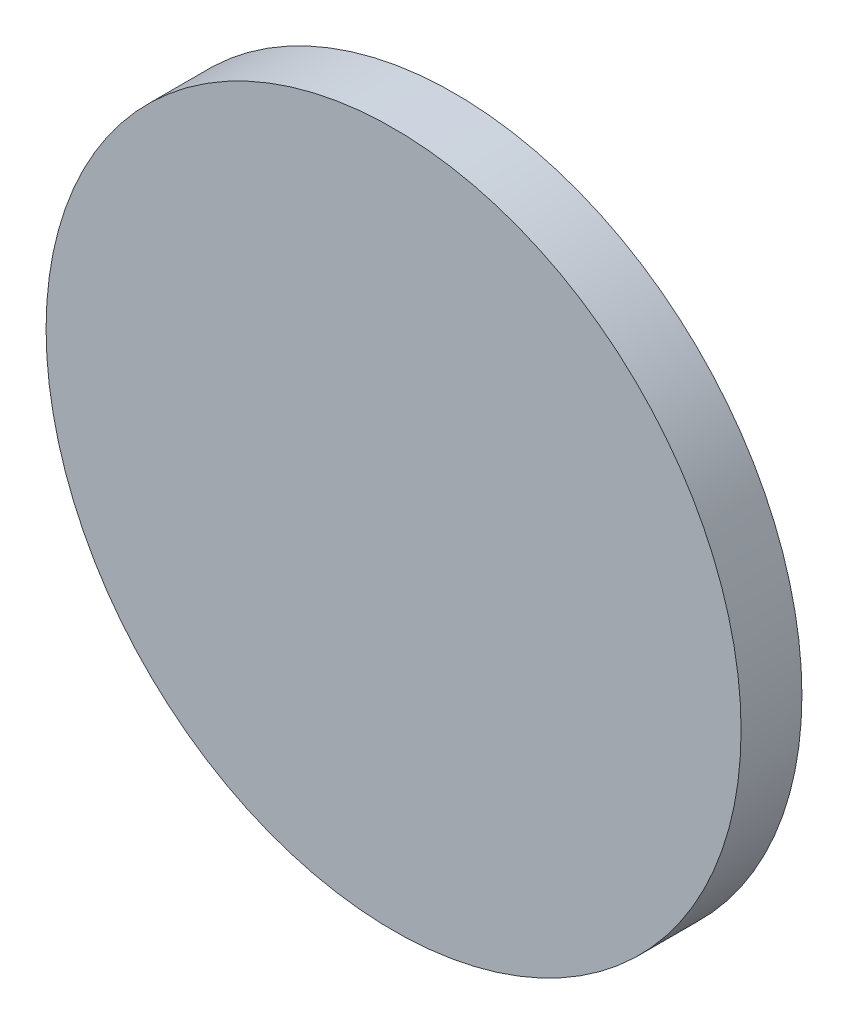
ISO-10303-21;
HEADER;
FILE_DESCRIPTION(('STEP AP214'),'2;1');
FILE_NAME('part.step','',(''),(''),'','','');
FILE_SCHEMA(('AUTOMOTIVE_DESIGN { 1 0 10303 214 1 1 1 1 }'));
ENDSEC;
DATA;
#1=APPLICATION_CONTEXT('core data for automotive mechanical design processes');
#2=APPLICATION_PROTOCOL_DEFINITION('international standard','automotive_design',2000,#1);
#3=PRODUCT_CONTEXT('',#1,'mechanical');
#4=PRODUCT('Part','Part','',(#3));
#5=PRODUCT_RELATED_PRODUCT_CATEGORY('part','',(#4));
#6=PRODUCT_DEFINITION_FORMATION('','',#4);
#7=PRODUCT_DEFINITION_CONTEXT('part definition',#1,'design');
#8=PRODUCT_DEFINITION('design','',#6,#7);
#9=PRODUCT_DEFINITION_SHAPE('','',#8);
#10=(LENGTH_UNIT() NAMED_UNIT(*) SI_UNIT(.MILLI.,.METRE.));
#11=(NAMED_UNIT(*) PLANE_ANGLE_UNIT() SI_UNIT($,.RADIAN.));
#12=(NAMED_UNIT(*) SI_UNIT($,.STERADIAN.) SOLID_ANGLE_UNIT());
#13=UNCERTAINTY_MEASURE_WITH_UNIT(LENGTH_MEASURE(1.E-05),#10,'distance_accuracy_value','');
#14=(GEOMETRIC_REPRESENTATION_CONTEXT(3) GLOBAL_UNCERTAINTY_ASSIGNED_CONTEXT((#13)) GLOBAL_UNIT_ASSIGNED_CONTEXT((#10,
#11,#12)) REPRESENTATION_CONTEXT('',''));
#15=CARTESIAN_POINT('',(0.,0.,0.));
#16=DIRECTION('',(0.,0.,1.));
#17=DIRECTION('',(1.,0.,0.));
#18=AXIS2_PLACEMENT_3D('',#15,#16,#17);
#19=CARTESIAN_POINT('',(0.,0.,10.));
#20=DIRECTION('',(0.,0.,-1.));
#21=DIRECTION('',(-1.,0.,0.));
#22=AXIS2_PLACEMENT_3D('',#19,#20,#21);
#23=CYLINDRICAL_SURFACE('',#22,57.1162750933714);
#24=CARTESIAN_POINT('',(0.,0.,10.));
#25=DIRECTION('',(0.,0.,1.));
#26=DIRECTION('',(1.,0.,0.));
#27=AXIS2_PLACEMENT_3D('',#24,#25,#26);
#28=CIRCLE('',#27,57.1162750933714);
#29=CARTESIAN_POINT('',(57.1162750933714,0.,10.));
#30=VERTEX_POINT('',#29);
#31=EDGE_CURVE('E10',#30,#30,#28,.T.);
#32=ORIENTED_EDGE('',*,*,#31,.F.);
#33=EDGE_LOOP('',(#32));
#34=FACE_BOUND('',#33,.T.);
#35=CARTESIAN_POINT('',(0.,0.,0.));
#36=DIRECTION('',(0.,0.,1.));
#37=DIRECTION('',(1.,0.,0.));
#38=AXIS2_PLACEMENT_3D('',#35,#36,#37);
#39=CIRCLE('',#38,57.1162750933714);
#40=CARTESIAN_POINT('',(57.1162750933714,0.,0.));
#41=VERTEX_POINT('',#40);
#42=EDGE_CURVE('E34',#41,#41,#39,.T.);
#43=ORIENTED_EDGE('',*,*,#42,.T.);
#44=EDGE_LOOP('',(#43));
#45=FACE_BOUND('',#44,.T.);
#46=ADVANCED_FACE('F31',(#34,#45),#23,.T.);
#47=CARTESIAN_POINT('',(0.,0.,10.));
#48=DIRECTION('',(0.,0.,1.));
#49=DIRECTION('',(1.,0.,0.));
#50=AXIS2_PLACEMENT_3D('',#47,#48,#49);
#51=PLANE('',#50);
#52=ORIENTED_EDGE('',*,*,#31,.T.);
#53=EDGE_LOOP('',(#52));
#54=FACE_BOUND('',#53,.T.);
#55=ADVANCED_FACE('F46',(#54),#51,.T.);
#56=CARTESIAN_POINT('',(0.,0.,0.));
#57=DIRECTION('',(0.,0.,1.));
#58=DIRECTION('',(1.,0.,0.));
#59=AXIS2_PLACEMENT_3D('',#56,#57,#58);
#60=PLANE('',#59);
#61=ORIENTED_EDGE('',*,*,#42,.F.);
#62=EDGE_LOOP('',(#61));
#63=FACE_BOUND('',#62,.T.);
#64=ADVANCED_FACE('F44',(#63),#60,.F.);
#65=CLOSED_SHELL('',(#46,#55,#64));
#66=MANIFOLD_SOLID_BREP('B2',#65);
#67=ADVANCED_BREP_SHAPE_REPRESENTATION('',(#18,#66),#14);
#68=SHAPE_DEFINITION_REPRESENTATION(#9,#67);
ENDSEC;
END-ISO-10303-21;
